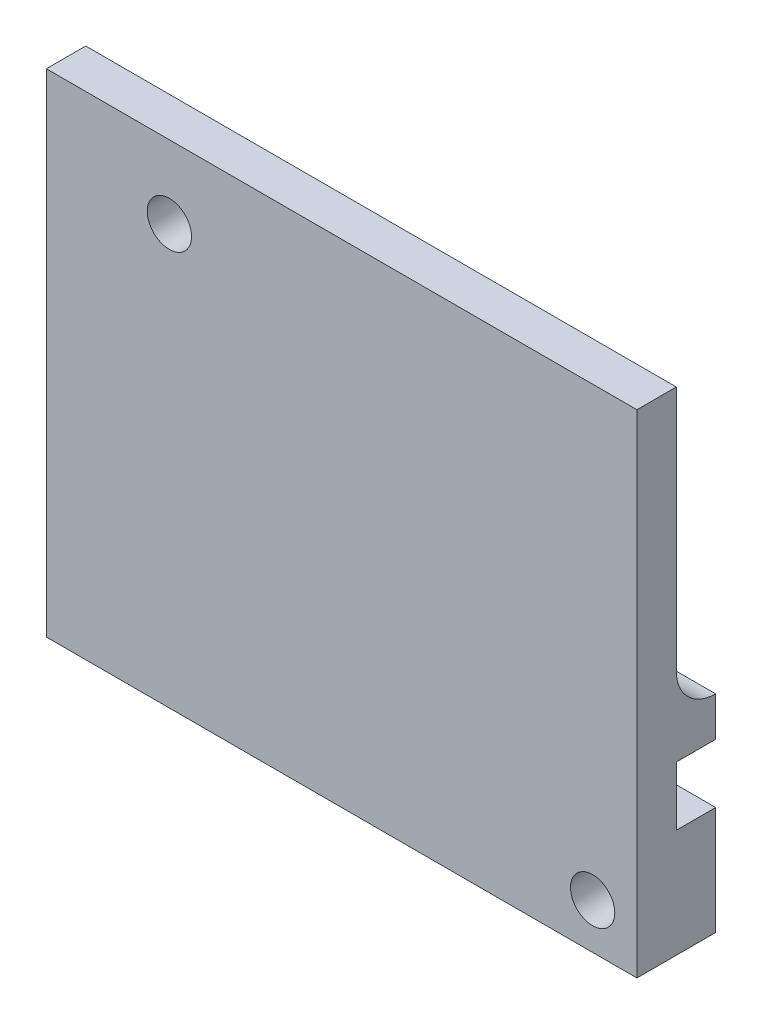
ISO-10303-21;
HEADER;
FILE_DESCRIPTION(('STEP AP214'),'2;1');
FILE_NAME('part.step','',(''),(''),'','','');
FILE_SCHEMA(('AUTOMOTIVE_DESIGN { 1 0 10303 214 1 1 1 1 }'));
ENDSEC;
DATA;
#1=APPLICATION_CONTEXT('core data for automotive mechanical design processes');
#2=APPLICATION_PROTOCOL_DEFINITION('international standard','automotive_design',2000,#1);
#3=PRODUCT_CONTEXT('',#1,'mechanical');
#4=PRODUCT('Part','Part','',(#3));
#5=PRODUCT_RELATED_PRODUCT_CATEGORY('part','',(#4));
#6=PRODUCT_DEFINITION_FORMATION('','',#4);
#7=PRODUCT_DEFINITION_CONTEXT('part definition',#1,'design');
#8=PRODUCT_DEFINITION('design','',#6,#7);
#9=PRODUCT_DEFINITION_SHAPE('','',#8);
#10=(LENGTH_UNIT() NAMED_UNIT(*) SI_UNIT(.MILLI.,.METRE.));
#11=(NAMED_UNIT(*) PLANE_ANGLE_UNIT() SI_UNIT($,.RADIAN.));
#12=(NAMED_UNIT(*) SI_UNIT($,.STERADIAN.) SOLID_ANGLE_UNIT());
#13=UNCERTAINTY_MEASURE_WITH_UNIT(LENGTH_MEASURE(1.E-05),#10,'distance_accuracy_value','');
#14=(GEOMETRIC_REPRESENTATION_CONTEXT(3) GLOBAL_UNCERTAINTY_ASSIGNED_CONTEXT((#13)) GLOBAL_UNIT_ASSIGNED_CONTEXT((#10,
#11,#12)) REPRESENTATION_CONTEXT('',''));
#15=CARTESIAN_POINT('',(0.,0.,0.));
#16=DIRECTION('',(0.,0.,1.));
#17=DIRECTION('',(1.,0.,0.));
#18=AXIS2_PLACEMENT_3D('',#15,#16,#17);
#19=CARTESIAN_POINT('',(0.,0.,0.));
#20=DIRECTION('',(0.,0.,-1.));
#21=DIRECTION('',(-1.,0.,0.));
#22=AXIS2_PLACEMENT_3D('',#19,#20,#21);
#23=PLANE('',#22);
#24=DIRECTION('',(0.,1.,0.));
#25=VECTOR('',#24,1.);
#26=CARTESIAN_POINT('',(60.,0.,0.));
#27=LINE('',#26,#25);
#28=CARTESIAN_POINT('',(60.,11.,0.));
#29=VERTEX_POINT('',#28);
#30=CARTESIAN_POINT('',(60.,17.,0.));
#31=VERTEX_POINT('',#30);
#32=EDGE_CURVE('E246',#29,#31,#27,.T.);
#33=ORIENTED_EDGE('',*,*,#32,.F.);
#34=DIRECTION('',(1.,0.,0.));
#35=VECTOR('',#34,1.);
#36=CARTESIAN_POINT('',(60.,11.,0.));
#37=LINE('',#36,#35);
#38=CARTESIAN_POINT('',(39.,11.,0.));
#39=VERTEX_POINT('',#38);
#40=EDGE_CURVE('E322',#39,#29,#37,.T.);
#41=ORIENTED_EDGE('',*,*,#40,.F.);
#42=CARTESIAN_POINT('',(39.,5.00000000000001,0.));
#43=DIRECTION('',(0.,0.,-1.));
#44=DIRECTION('',(-1.,0.,0.));
#45=AXIS2_PLACEMENT_3D('',#42,#43,#44);
#46=CIRCLE('',#45,6.00000000000001);
#47=CARTESIAN_POINT('',(33.,5.00000000000002,0.));
#48=VERTEX_POINT('',#47);
#49=EDGE_CURVE('E176',#48,#39,#46,.T.);
#50=ORIENTED_EDGE('',*,*,#49,.F.);
#51=DIRECTION('',(0.,1.,0.));
#52=VECTOR('',#51,1.);
#53=CARTESIAN_POINT('',(33.,5.00000000000002,0.));
#54=LINE('',#53,#52);
#55=CARTESIAN_POINT('',(33.,0.,0.));
#56=VERTEX_POINT('',#55);
#57=EDGE_CURVE('E172',#56,#48,#54,.T.);
#58=ORIENTED_EDGE('',*,*,#57,.F.);
#59=DIRECTION('',(1.,0.,0.));
#60=VECTOR('',#59,1.);
#61=CARTESIAN_POINT('',(0.,0.,0.));
#62=LINE('',#61,#60);
#63=CARTESIAN_POINT('',(27.,0.,0.));
#64=VERTEX_POINT('',#63);
#65=EDGE_CURVE('E243',#64,#56,#62,.T.);
#66=ORIENTED_EDGE('',*,*,#65,.F.);
#67=DIRECTION('',(0.,-1.,0.));
#68=VECTOR('',#67,1.);
#69=CARTESIAN_POINT('',(27.,5.00000000000002,0.));
#70=LINE('',#69,#68);
#71=CARTESIAN_POINT('',(27.,5.00000000000002,0.));
#72=VERTEX_POINT('',#71);
#73=EDGE_CURVE('E190',#72,#64,#70,.T.);
#74=ORIENTED_EDGE('',*,*,#73,.F.);
#75=CARTESIAN_POINT('',(21.,5.00000000000002,0.));
#76=DIRECTION('',(0.,0.,-1.));
#77=DIRECTION('',(-1.,0.,0.));
#78=AXIS2_PLACEMENT_3D('',#75,#76,#77);
#79=CIRCLE('',#78,6.);
#80=CARTESIAN_POINT('',(21.,11.,0.));
#81=VERTEX_POINT('',#80);
#82=EDGE_CURVE('E180',#81,#72,#79,.T.);
#83=ORIENTED_EDGE('',*,*,#82,.F.);
#84=DIRECTION('',(1.,0.,0.));
#85=VECTOR('',#84,1.);
#86=CARTESIAN_POINT('',(0.,11.,0.));
#87=LINE('',#86,#85);
#88=CARTESIAN_POINT('',(0.,11.,0.));
#89=VERTEX_POINT('',#88);
#90=EDGE_CURVE('E178',#89,#81,#87,.T.);
#91=ORIENTED_EDGE('',*,*,#90,.F.);
#92=DIRECTION('',(0.,-1.,0.));
#93=VECTOR('',#92,1.);
#94=CARTESIAN_POINT('',(0.,0.,0.));
#95=LINE('',#94,#93);
#96=CARTESIAN_POINT('',(0.,17.,0.));
#97=VERTEX_POINT('',#96);
#98=EDGE_CURVE('E228',#97,#89,#95,.T.);
#99=ORIENTED_EDGE('',*,*,#98,.F.);
#100=DIRECTION('',(-1.,0.,0.));
#101=VECTOR('',#100,1.);
#102=CARTESIAN_POINT('',(0.,17.,0.));
#103=LINE('',#102,#101);
#104=EDGE_CURVE('E209',#31,#97,#103,.T.);
#105=ORIENTED_EDGE('',*,*,#104,.F.);
#106=EDGE_LOOP('',(#33,#41,#50,#58,#66,#74,#83,#91,#99,#105));
#107=FACE_BOUND('',#106,.T.);
#108=ADVANCED_FACE('F40',(#107),#23,.T.);
#109=CARTESIAN_POINT('',(0.,0.,4.));
#110=DIRECTION('',(1.,0.,0.));
#111=DIRECTION('',(0.,0.,-1.));
#112=AXIS2_PLACEMENT_3D('',#109,#110,#111);
#113=PLANE('',#112);
#114=CARTESIAN_POINT('',(0.,50.,0.));
#115=VERTEX_POINT('',#114);
#116=CARTESIAN_POINT('',(0.,25.,0.));
#117=VERTEX_POINT('',#116);
#118=EDGE_CURVE('E240',#115,#117,#95,.T.);
#119=ORIENTED_EDGE('',*,*,#118,.T.);
#120=CARTESIAN_POINT('',(0.,25.,-4.));
#121=DIRECTION('',(1.,0.,0.));
#122=DIRECTION('',(0.,0.,-1.));
#123=AXIS2_PLACEMENT_3D('',#120,#121,#122);
#124=CIRCLE('',#123,4.);
#125=CARTESIAN_POINT('',(0.,21.,-4.));
#126=VERTEX_POINT('',#125);
#127=EDGE_CURVE('E11',#117,#126,#124,.T.);
#128=ORIENTED_EDGE('',*,*,#127,.T.);
#129=DIRECTION('',(0.,1.,0.));
#130=VECTOR('',#129,1.);
#131=CARTESIAN_POINT('',(0.,21.,-4.));
#132=LINE('',#131,#130);
#133=CARTESIAN_POINT('',(0.,17.,-4.));
#134=VERTEX_POINT('',#133);
#135=EDGE_CURVE('E210',#134,#126,#132,.T.);
#136=ORIENTED_EDGE('',*,*,#135,.F.);
#137=DIRECTION('',(0.,0.,1.));
#138=VECTOR('',#137,1.);
#139=CARTESIAN_POINT('',(0.,17.,-4.));
#140=LINE('',#139,#138);
#141=EDGE_CURVE('E220',#134,#97,#140,.T.);
#142=ORIENTED_EDGE('',*,*,#141,.T.);
#143=ORIENTED_EDGE('',*,*,#98,.T.);
#144=DIRECTION('',(0.,0.,1.));
#145=VECTOR('',#144,1.);
#146=CARTESIAN_POINT('',(0.,11.,-4.));
#147=LINE('',#146,#145);
#148=CARTESIAN_POINT('',(0.,11.,-4.));
#149=VERTEX_POINT('',#148);
#150=EDGE_CURVE('E207',#149,#89,#147,.T.);
#151=ORIENTED_EDGE('',*,*,#150,.F.);
#152=DIRECTION('',(0.,1.,0.));
#153=VECTOR('',#152,1.);
#154=CARTESIAN_POINT('',(0.,0.,-4.));
#155=LINE('',#154,#153);
#156=CARTESIAN_POINT('',(0.,0.,-4.));
#157=VERTEX_POINT('',#156);
#158=EDGE_CURVE('E189',#157,#149,#155,.T.);
#159=ORIENTED_EDGE('',*,*,#158,.F.);
#160=DIRECTION('',(0.,0.,-1.));
#161=VECTOR('',#160,1.);
#162=CARTESIAN_POINT('',(0.,0.,4.));
#163=LINE('',#162,#161);
#164=CARTESIAN_POINT('',(0.,0.,4.));
#165=VERTEX_POINT('',#164);
#166=EDGE_CURVE('E256',#165,#157,#163,.T.);
#167=ORIENTED_EDGE('',*,*,#166,.F.);
#168=DIRECTION('',(0.,-1.,0.));
#169=VECTOR('',#168,1.);
#170=CARTESIAN_POINT('',(0.,0.,4.));
#171=LINE('',#170,#169);
#172=CARTESIAN_POINT('',(0.,50.,4.));
#173=VERTEX_POINT('',#172);
#174=EDGE_CURVE('E229',#173,#165,#171,.T.);
#175=ORIENTED_EDGE('',*,*,#174,.F.);
#176=DIRECTION('',(0.,0.,-1.));
#177=VECTOR('',#176,1.);
#178=CARTESIAN_POINT('',(0.,50.,4.));
#179=LINE('',#178,#177);
#180=EDGE_CURVE('E239',#173,#115,#179,.T.);
#181=ORIENTED_EDGE('',*,*,#180,.T.);
#182=EDGE_LOOP('',(#119,#128,#136,#142,#143,#151,#159,#167,#175,#181));
#183=FACE_BOUND('',#182,.T.);
#184=ADVANCED_FACE('F275',(#183),#113,.F.);
#185=CARTESIAN_POINT('',(0.,0.,4.));
#186=DIRECTION('',(0.,1.,0.));
#187=DIRECTION('',(0.,0.,1.));
#188=AXIS2_PLACEMENT_3D('',#185,#186,#187);
#189=PLANE('',#188);
#190=ORIENTED_EDGE('',*,*,#166,.T.);
#191=DIRECTION('',(-1.,0.,0.));
#192=VECTOR('',#191,1.);
#193=CARTESIAN_POINT('',(27.,0.,-4.));
#194=LINE('',#193,#192);
#195=CARTESIAN_POINT('',(27.,0.,-4.));
#196=VERTEX_POINT('',#195);
#197=EDGE_CURVE('E186',#196,#157,#194,.T.);
#198=ORIENTED_EDGE('',*,*,#197,.F.);
#199=DIRECTION('',(0.,0.,1.));
#200=VECTOR('',#199,1.);
#201=CARTESIAN_POINT('',(27.,0.,-4.));
#202=LINE('',#201,#200);
#203=EDGE_CURVE('E64',#196,#64,#202,.T.);
#204=ORIENTED_EDGE('',*,*,#203,.T.);
#205=ORIENTED_EDGE('',*,*,#65,.T.);
#206=DIRECTION('',(0.,0.,1.));
#207=VECTOR('',#206,1.);
#208=CARTESIAN_POINT('',(33.,0.,-4.));
#209=LINE('',#208,#207);
#210=CARTESIAN_POINT('',(33.,0.,-4.));
#211=VERTEX_POINT('',#210);
#212=EDGE_CURVE('E182',#211,#56,#209,.T.);
#213=ORIENTED_EDGE('',*,*,#212,.F.);
#214=DIRECTION('',(-1.,0.,0.));
#215=VECTOR('',#214,1.);
#216=CARTESIAN_POINT('',(33.,0.,-4.));
#217=LINE('',#216,#215);
#218=CARTESIAN_POINT('',(60.,0.,-4.));
#219=VERTEX_POINT('',#218);
#220=EDGE_CURVE('E314',#219,#211,#217,.T.);
#221=ORIENTED_EDGE('',*,*,#220,.F.);
#222=DIRECTION('',(0.,0.,-1.));
#223=VECTOR('',#222,1.);
#224=CARTESIAN_POINT('',(60.,0.,4.));
#225=LINE('',#224,#223);
#226=CARTESIAN_POINT('',(60.,0.,4.));
#227=VERTEX_POINT('',#226);
#228=EDGE_CURVE('E254',#227,#219,#225,.T.);
#229=ORIENTED_EDGE('',*,*,#228,.F.);
#230=DIRECTION('',(1.,0.,0.));
#231=VECTOR('',#230,1.);
#232=CARTESIAN_POINT('',(0.,0.,4.));
#233=LINE('',#232,#231);
#234=EDGE_CURVE('E232',#165,#227,#233,.T.);
#235=ORIENTED_EDGE('',*,*,#234,.F.);
#236=EDGE_LOOP('',(#190,#198,#204,#205,#213,#221,#229,#235));
#237=FACE_BOUND('',#236,.T.);
#238=ADVANCED_FACE('F304',(#237),#189,.F.);
#239=CARTESIAN_POINT('',(60.,0.,4.));
#240=DIRECTION('',(-1.,0.,0.));
#241=DIRECTION('',(0.,0.,1.));
#242=AXIS2_PLACEMENT_3D('',#239,#240,#241);
#243=PLANE('',#242);
#244=ORIENTED_EDGE('',*,*,#228,.T.);
#245=DIRECTION('',(0.,-1.,0.));
#246=VECTOR('',#245,1.);
#247=CARTESIAN_POINT('',(60.,0.,-4.));
#248=LINE('',#247,#246);
#249=CARTESIAN_POINT('',(60.,11.,-4.));
#250=VERTEX_POINT('',#249);
#251=EDGE_CURVE('E162',#250,#219,#248,.T.);
#252=ORIENTED_EDGE('',*,*,#251,.F.);
#253=DIRECTION('',(0.,0.,1.));
#254=VECTOR('',#253,1.);
#255=CARTESIAN_POINT('',(60.,11.,-4.));
#256=LINE('',#255,#254);
#257=EDGE_CURVE('E56',#250,#29,#256,.T.);
#258=ORIENTED_EDGE('',*,*,#257,.T.);
#259=ORIENTED_EDGE('',*,*,#32,.T.);
#260=DIRECTION('',(0.,0.,1.));
#261=VECTOR('',#260,1.);
#262=CARTESIAN_POINT('',(60.,17.,-4.));
#263=LINE('',#262,#261);
#264=CARTESIAN_POINT('',(60.,17.,-4.));
#265=VERTEX_POINT('',#264);
#266=EDGE_CURVE('E225',#265,#31,#263,.T.);
#267=ORIENTED_EDGE('',*,*,#266,.F.);
#268=DIRECTION('',(0.,-1.,0.));
#269=VECTOR('',#268,1.);
#270=CARTESIAN_POINT('',(60.,21.,-4.));
#271=LINE('',#270,#269);
#272=CARTESIAN_POINT('',(60.,21.,-4.));
#273=VERTEX_POINT('',#272);
#274=EDGE_CURVE('E216',#273,#265,#271,.T.);
#275=ORIENTED_EDGE('',*,*,#274,.F.);
#276=CARTESIAN_POINT('',(60.,25.,-4.));
#277=DIRECTION('',(-1.,0.,0.));
#278=DIRECTION('',(0.,0.,1.));
#279=AXIS2_PLACEMENT_3D('',#276,#277,#278);
#280=CIRCLE('',#279,4.);
#281=CARTESIAN_POINT('',(60.,25.,0.));
#282=VERTEX_POINT('',#281);
#283=EDGE_CURVE('E49',#273,#282,#280,.T.);
#284=ORIENTED_EDGE('',*,*,#283,.T.);
#285=CARTESIAN_POINT('',(60.,50.,0.));
#286=VERTEX_POINT('',#285);
#287=EDGE_CURVE('E245',#282,#286,#27,.T.);
#288=ORIENTED_EDGE('',*,*,#287,.T.);
#289=DIRECTION('',(0.,0.,-1.));
#290=VECTOR('',#289,1.);
#291=CARTESIAN_POINT('',(60.,50.,4.));
#292=LINE('',#291,#290);
#293=CARTESIAN_POINT('',(60.,50.,4.));
#294=VERTEX_POINT('',#293);
#295=EDGE_CURVE('E251',#294,#286,#292,.T.);
#296=ORIENTED_EDGE('',*,*,#295,.F.);
#297=DIRECTION('',(0.,1.,0.));
#298=VECTOR('',#297,1.);
#299=CARTESIAN_POINT('',(60.,0.,4.));
#300=LINE('',#299,#298);
#301=EDGE_CURVE('E235',#227,#294,#300,.T.);
#302=ORIENTED_EDGE('',*,*,#301,.F.);
#303=EDGE_LOOP('',(#244,#252,#258,#259,#267,#275,#284,#288,#296,#302));
#304=FACE_BOUND('',#303,.T.);
#305=ADVANCED_FACE('F262',(#304),#243,.F.);
#306=CARTESIAN_POINT('',(0.,50.,4.));
#307=DIRECTION('',(0.,-1.,0.));
#308=DIRECTION('',(0.,0.,-1.));
#309=AXIS2_PLACEMENT_3D('',#306,#307,#308);
#310=PLANE('',#309);
#311=DIRECTION('',(-1.,0.,0.));
#312=VECTOR('',#311,1.);
#313=CARTESIAN_POINT('',(0.,50.,0.));
#314=LINE('',#313,#312);
#315=EDGE_CURVE('E233',#286,#115,#314,.T.);
#316=ORIENTED_EDGE('',*,*,#315,.T.);
#317=ORIENTED_EDGE('',*,*,#180,.F.);
#318=DIRECTION('',(-1.,0.,0.));
#319=VECTOR('',#318,1.);
#320=CARTESIAN_POINT('',(0.,50.,4.));
#321=LINE('',#320,#319);
#322=EDGE_CURVE('E237',#294,#173,#321,.T.);
#323=ORIENTED_EDGE('',*,*,#322,.F.);
#324=ORIENTED_EDGE('',*,*,#295,.T.);
#325=EDGE_LOOP('',(#316,#317,#323,#324));
#326=FACE_BOUND('',#325,.T.);
#327=ADVANCED_FACE('F313',(#326),#310,.F.);
#328=CARTESIAN_POINT('',(0.,0.,4.));
#329=DIRECTION('',(0.,0.,-1.));
#330=DIRECTION('',(-1.,0.,0.));
#331=AXIS2_PLACEMENT_3D('',#328,#329,#330);
#332=PLANE('',#331);
#333=CARTESIAN_POINT('',(12.5,42.6000000000001,4.));
#334=DIRECTION('',(0.,0.,1.));
#335=DIRECTION('',(1.,0.,0.));
#336=AXIS2_PLACEMENT_3D('',#333,#334,#335);
#337=CIRCLE('',#336,2.24999999999999);
#338=CARTESIAN_POINT('',(14.75,42.6000000000001,4.));
#339=VERTEX_POINT('',#338);
#340=EDGE_CURVE('E357',#339,#339,#337,.T.);
#341=ORIENTED_EDGE('',*,*,#340,.F.);
#342=EDGE_LOOP('',(#341));
#343=FACE_BOUND('',#342,.T.);
#344=CARTESIAN_POINT('',(55.4999999999999,4.60000000000001,4.));
#345=DIRECTION('',(0.,0.,1.));
#346=DIRECTION('',(1.,0.,0.));
#347=AXIS2_PLACEMENT_3D('',#344,#345,#346);
#348=CIRCLE('',#347,2.25);
#349=CARTESIAN_POINT('',(57.7499999999999,4.60000000000001,4.));
#350=VERTEX_POINT('',#349);
#351=EDGE_CURVE('E364',#350,#350,#348,.T.);
#352=ORIENTED_EDGE('',*,*,#351,.F.);
#353=EDGE_LOOP('',(#352));
#354=FACE_BOUND('',#353,.T.);
#355=ORIENTED_EDGE('',*,*,#174,.T.);
#356=ORIENTED_EDGE('',*,*,#234,.T.);
#357=ORIENTED_EDGE('',*,*,#301,.T.);
#358=ORIENTED_EDGE('',*,*,#322,.T.);
#359=EDGE_LOOP('',(#355,#356,#357,#358));
#360=FACE_BOUND('',#359,.T.);
#361=ADVANCED_FACE('F309',(#343,#354,#360),#332,.F.);
#362=CARTESIAN_POINT('',(12.5,42.6000000000001,0.));
#363=DIRECTION('',(0.,0.,-1.));
#364=DIRECTION('',(-1.,0.,0.));
#365=AXIS2_PLACEMENT_3D('',#362,#363,#364);
#366=CIRCLE('',#365,2.24999999999999);
#367=CARTESIAN_POINT('',(10.25,42.6000000000001,0.));
#368=VERTEX_POINT('',#367);
#369=EDGE_CURVE('E44',#368,#368,#366,.T.);
#370=ORIENTED_EDGE('',*,*,#369,.F.);
#371=EDGE_LOOP('',(#370));
#372=FACE_BOUND('',#371,.T.);
#373=ORIENTED_EDGE('',*,*,#287,.F.);
#374=DIRECTION('',(1.,0.,0.));
#375=VECTOR('',#374,1.);
#376=CARTESIAN_POINT('',(0.,25.,0.));
#377=LINE('',#376,#375);
#378=EDGE_CURVE('E258',#282,#117,#377,.F.);
#379=ORIENTED_EDGE('',*,*,#378,.T.);
#380=ORIENTED_EDGE('',*,*,#118,.F.);
#381=ORIENTED_EDGE('',*,*,#315,.F.);
#382=EDGE_LOOP('',(#373,#379,#380,#381));
#383=FACE_BOUND('',#382,.T.);
#384=ADVANCED_FACE('F270',(#372,#383),#23,.T.);
#385=CARTESIAN_POINT('',(0.,17.,-4.));
#386=DIRECTION('',(0.,1.,0.));
#387=DIRECTION('',(-1.,0.,0.));
#388=AXIS2_PLACEMENT_3D('',#385,#386,#387);
#389=PLANE('',#388);
#390=ORIENTED_EDGE('',*,*,#104,.T.);
#391=ORIENTED_EDGE('',*,*,#141,.F.);
#392=DIRECTION('',(-1.,0.,0.));
#393=VECTOR('',#392,1.);
#394=CARTESIAN_POINT('',(0.,17.,-4.));
#395=LINE('',#394,#393);
#396=EDGE_CURVE('E218',#265,#134,#395,.T.);
#397=ORIENTED_EDGE('',*,*,#396,.F.);
#398=ORIENTED_EDGE('',*,*,#266,.T.);
#399=EDGE_LOOP('',(#390,#391,#397,#398));
#400=FACE_BOUND('',#399,.T.);
#401=ADVANCED_FACE('F281',(#400),#389,.F.);
#402=CARTESIAN_POINT('',(0.,0.,-4.));
#403=DIRECTION('',(0.,0.,1.));
#404=DIRECTION('',(1.,0.,0.));
#405=AXIS2_PLACEMENT_3D('',#402,#403,#404);
#406=PLANE('',#405);
#407=ORIENTED_EDGE('',*,*,#135,.T.);
#408=DIRECTION('',(1.,0.,0.));
#409=VECTOR('',#408,1.);
#410=CARTESIAN_POINT('',(0.,21.,-4.));
#411=LINE('',#410,#409);
#412=EDGE_CURVE('E213',#126,#273,#411,.T.);
#413=ORIENTED_EDGE('',*,*,#412,.T.);
#414=ORIENTED_EDGE('',*,*,#274,.T.);
#415=ORIENTED_EDGE('',*,*,#396,.T.);
#416=EDGE_LOOP('',(#407,#413,#414,#415));
#417=FACE_BOUND('',#416,.T.);
#418=ADVANCED_FACE('F277',(#417),#406,.F.);
#419=CARTESIAN_POINT('',(0.,25.,-4.));
#420=DIRECTION('',(1.,0.,0.));
#421=DIRECTION('',(0.,1.,0.));
#422=AXIS2_PLACEMENT_3D('',#419,#420,#421);
#423=CYLINDRICAL_SURFACE('',#422,4.);
#424=ORIENTED_EDGE('',*,*,#127,.F.);
#425=ORIENTED_EDGE('',*,*,#378,.F.);
#426=ORIENTED_EDGE('',*,*,#283,.F.);
#427=ORIENTED_EDGE('',*,*,#412,.F.);
#428=EDGE_LOOP('',(#424,#425,#426,#427));
#429=FACE_BOUND('',#428,.T.);
#430=ADVANCED_FACE('F42',(#429),#423,.F.);
#431=CARTESIAN_POINT('',(0.,11.,-4.));
#432=DIRECTION('',(0.,-1.,0.));
#433=DIRECTION('',(0.,0.,-1.));
#434=AXIS2_PLACEMENT_3D('',#431,#432,#433);
#435=PLANE('',#434);
#436=ORIENTED_EDGE('',*,*,#90,.T.);
#437=DIRECTION('',(0.,0.,1.));
#438=VECTOR('',#437,1.);
#439=CARTESIAN_POINT('',(21.,11.,-4.));
#440=LINE('',#439,#438);
#441=CARTESIAN_POINT('',(21.,11.,-4.));
#442=VERTEX_POINT('',#441);
#443=EDGE_CURVE('E204',#442,#81,#440,.T.);
#444=ORIENTED_EDGE('',*,*,#443,.F.);
#445=DIRECTION('',(1.,0.,0.));
#446=VECTOR('',#445,1.);
#447=CARTESIAN_POINT('',(0.,11.,-4.));
#448=LINE('',#447,#446);
#449=EDGE_CURVE('E192',#149,#442,#448,.T.);
#450=ORIENTED_EDGE('',*,*,#449,.F.);
#451=ORIENTED_EDGE('',*,*,#150,.T.);
#452=EDGE_LOOP('',(#436,#444,#450,#451));
#453=FACE_BOUND('',#452,.T.);
#454=ADVANCED_FACE('F294',(#453),#435,.F.);
#455=CARTESIAN_POINT('',(21.,5.00000000000002,-4.));
#456=DIRECTION('',(0.,0.,1.));
#457=DIRECTION('',(1.,0.,0.));
#458=AXIS2_PLACEMENT_3D('',#455,#456,#457);
#459=CYLINDRICAL_SURFACE('',#458,6.);
#460=ORIENTED_EDGE('',*,*,#82,.T.);
#461=DIRECTION('',(0.,0.,1.));
#462=VECTOR('',#461,1.);
#463=CARTESIAN_POINT('',(27.,5.00000000000002,-4.));
#464=LINE('',#463,#462);
#465=CARTESIAN_POINT('',(27.,5.00000000000002,-4.));
#466=VERTEX_POINT('',#465);
#467=EDGE_CURVE('E201',#466,#72,#464,.T.);
#468=ORIENTED_EDGE('',*,*,#467,.F.);
#469=CARTESIAN_POINT('',(21.,5.00000000000002,-4.));
#470=DIRECTION('',(0.,0.,-1.));
#471=DIRECTION('',(-1.,0.,0.));
#472=AXIS2_PLACEMENT_3D('',#469,#470,#471);
#473=CIRCLE('',#472,6.);
#474=EDGE_CURVE('E194',#442,#466,#473,.T.);
#475=ORIENTED_EDGE('',*,*,#474,.F.);
#476=ORIENTED_EDGE('',*,*,#443,.T.);
#477=EDGE_LOOP('',(#460,#468,#475,#476));
#478=FACE_BOUND('',#477,.T.);
#479=ADVANCED_FACE('F297',(#478),#459,.T.);
#480=CARTESIAN_POINT('',(27.,5.00000000000002,-4.));
#481=DIRECTION('',(-1.,0.,0.));
#482=DIRECTION('',(0.,0.,1.));
#483=AXIS2_PLACEMENT_3D('',#480,#481,#482);
#484=PLANE('',#483);
#485=ORIENTED_EDGE('',*,*,#73,.T.);
#486=ORIENTED_EDGE('',*,*,#203,.F.);
#487=DIRECTION('',(0.,-1.,0.));
#488=VECTOR('',#487,1.);
#489=CARTESIAN_POINT('',(27.,5.00000000000002,-4.));
#490=LINE('',#489,#488);
#491=EDGE_CURVE('E196',#466,#196,#490,.T.);
#492=ORIENTED_EDGE('',*,*,#491,.F.);
#493=ORIENTED_EDGE('',*,*,#467,.T.);
#494=EDGE_LOOP('',(#485,#486,#492,#493));
#495=FACE_BOUND('',#494,.T.);
#496=ADVANCED_FACE('F330',(#495),#484,.F.);
#497=CARTESIAN_POINT('',(21.,5.00000000000002,-4.));
#498=DIRECTION('',(0.,0.,-1.));
#499=DIRECTION('',(-1.,0.,0.));
#500=AXIS2_PLACEMENT_3D('',#497,#498,#499);
#501=PLANE('',#500);
#502=ORIENTED_EDGE('',*,*,#197,.T.);
#503=ORIENTED_EDGE('',*,*,#158,.T.);
#504=ORIENTED_EDGE('',*,*,#449,.T.);
#505=ORIENTED_EDGE('',*,*,#474,.T.);
#506=ORIENTED_EDGE('',*,*,#491,.T.);
#507=EDGE_LOOP('',(#502,#503,#504,#505,#506));
#508=FACE_BOUND('',#507,.T.);
#509=ADVANCED_FACE('F301',(#508),#501,.T.);
#510=CARTESIAN_POINT('',(39.,5.00000000000001,-4.));
#511=DIRECTION('',(0.,0.,1.));
#512=DIRECTION('',(1.,0.,0.));
#513=AXIS2_PLACEMENT_3D('',#510,#511,#512);
#514=CYLINDRICAL_SURFACE('',#513,6.00000000000001);
#515=ORIENTED_EDGE('',*,*,#49,.T.);
#516=DIRECTION('',(0.,0.,1.));
#517=VECTOR('',#516,1.);
#518=CARTESIAN_POINT('',(39.,11.,-4.));
#519=LINE('',#518,#517);
#520=CARTESIAN_POINT('',(39.,11.,-4.));
#521=VERTEX_POINT('',#520);
#522=EDGE_CURVE('E158',#521,#39,#519,.T.);
#523=ORIENTED_EDGE('',*,*,#522,.F.);
#524=CARTESIAN_POINT('',(39.,5.00000000000001,-4.));
#525=DIRECTION('',(0.,0.,-1.));
#526=DIRECTION('',(-1.,0.,0.));
#527=AXIS2_PLACEMENT_3D('',#524,#525,#526);
#528=CIRCLE('',#527,6.00000000000001);
#529=CARTESIAN_POINT('',(33.,5.00000000000002,-4.));
#530=VERTEX_POINT('',#529);
#531=EDGE_CURVE('E163',#530,#521,#528,.T.);
#532=ORIENTED_EDGE('',*,*,#531,.F.);
#533=DIRECTION('',(0.,0.,1.));
#534=VECTOR('',#533,1.);
#535=CARTESIAN_POINT('',(33.,5.00000000000002,-4.));
#536=LINE('',#535,#534);
#537=EDGE_CURVE('E318',#530,#48,#536,.T.);
#538=ORIENTED_EDGE('',*,*,#537,.T.);
#539=EDGE_LOOP('',(#515,#523,#532,#538));
#540=FACE_BOUND('',#539,.T.);
#541=ADVANCED_FACE('F174',(#540),#514,.T.);
#542=CARTESIAN_POINT('',(60.,11.,-4.));
#543=DIRECTION('',(0.,-1.,0.));
#544=DIRECTION('',(0.,0.,-1.));
#545=AXIS2_PLACEMENT_3D('',#542,#543,#544);
#546=PLANE('',#545);
#547=ORIENTED_EDGE('',*,*,#40,.T.);
#548=ORIENTED_EDGE('',*,*,#257,.F.);
#549=DIRECTION('',(1.,0.,0.));
#550=VECTOR('',#549,1.);
#551=CARTESIAN_POINT('',(60.,11.,-4.));
#552=LINE('',#551,#550);
#553=EDGE_CURVE('E154',#521,#250,#552,.T.);
#554=ORIENTED_EDGE('',*,*,#553,.F.);
#555=ORIENTED_EDGE('',*,*,#522,.T.);
#556=EDGE_LOOP('',(#547,#548,#554,#555));
#557=FACE_BOUND('',#556,.T.);
#558=ADVANCED_FACE('F156',(#557),#546,.F.);
#559=CARTESIAN_POINT('',(33.,5.00000000000002,-4.));
#560=DIRECTION('',(1.,0.,0.));
#561=DIRECTION('',(0.,0.,-1.));
#562=AXIS2_PLACEMENT_3D('',#559,#560,#561);
#563=PLANE('',#562);
#564=ORIENTED_EDGE('',*,*,#57,.T.);
#565=ORIENTED_EDGE('',*,*,#537,.F.);
#566=DIRECTION('',(0.,1.,0.));
#567=VECTOR('',#566,1.);
#568=CARTESIAN_POINT('',(33.,5.00000000000002,-4.));
#569=LINE('',#568,#567);
#570=EDGE_CURVE('E168',#211,#530,#569,.T.);
#571=ORIENTED_EDGE('',*,*,#570,.F.);
#572=ORIENTED_EDGE('',*,*,#212,.T.);
#573=EDGE_LOOP('',(#564,#565,#571,#572));
#574=FACE_BOUND('',#573,.T.);
#575=ADVANCED_FACE('F327',(#574),#563,.F.);
#576=CARTESIAN_POINT('',(39.,5.00000000000001,-4.));
#577=DIRECTION('',(0.,0.,-1.));
#578=DIRECTION('',(-1.,0.,0.));
#579=AXIS2_PLACEMENT_3D('',#576,#577,#578);
#580=PLANE('',#579);
#581=CARTESIAN_POINT('',(55.4999999999999,4.60000000000001,-4.));
#582=DIRECTION('',(0.,0.,1.));
#583=DIRECTION('',(1.,0.,0.));
#584=AXIS2_PLACEMENT_3D('',#581,#582,#583);
#585=CIRCLE('',#584,2.25);
#586=CARTESIAN_POINT('',(57.7499999999999,4.60000000000001,-4.));
#587=VERTEX_POINT('',#586);
#588=EDGE_CURVE('E359',#587,#587,#585,.T.);
#589=ORIENTED_EDGE('',*,*,#588,.T.);
#590=EDGE_LOOP('',(#589));
#591=FACE_BOUND('',#590,.T.);
#592=ORIENTED_EDGE('',*,*,#531,.T.);
#593=ORIENTED_EDGE('',*,*,#553,.T.);
#594=ORIENTED_EDGE('',*,*,#251,.T.);
#595=ORIENTED_EDGE('',*,*,#220,.T.);
#596=ORIENTED_EDGE('',*,*,#570,.T.);
#597=EDGE_LOOP('',(#592,#593,#594,#595,#596));
#598=FACE_BOUND('',#597,.T.);
#599=ADVANCED_FACE('F166',(#591,#598),#580,.T.);
#600=CARTESIAN_POINT('',(55.4999999999999,4.60000000000001,-4.));
#601=DIRECTION('',(0.,0.,1.));
#602=DIRECTION('',(1.,0.,0.));
#603=AXIS2_PLACEMENT_3D('',#600,#601,#602);
#604=CYLINDRICAL_SURFACE('',#603,2.25);
#605=ORIENTED_EDGE('',*,*,#588,.F.);
#606=EDGE_LOOP('',(#605));
#607=FACE_BOUND('',#606,.T.);
#608=ORIENTED_EDGE('',*,*,#351,.T.);
#609=EDGE_LOOP('',(#608));
#610=FACE_BOUND('',#609,.T.);
#611=ADVANCED_FACE('F370',(#607,#610),#604,.F.);
#612=CARTESIAN_POINT('',(12.5,42.6000000000001,-4.));
#613=DIRECTION('',(0.,0.,1.));
#614=DIRECTION('',(1.,0.,0.));
#615=AXIS2_PLACEMENT_3D('',#612,#613,#614);
#616=CYLINDRICAL_SURFACE('',#615,2.24999999999999);
#617=ORIENTED_EDGE('',*,*,#369,.T.);
#618=EDGE_LOOP('',(#617));
#619=FACE_BOUND('',#618,.T.);
#620=ORIENTED_EDGE('',*,*,#340,.T.);
#621=EDGE_LOOP('',(#620));
#622=FACE_BOUND('',#621,.T.);
#623=ADVANCED_FACE('F373',(#619,#622),#616,.F.);
#624=CLOSED_SHELL('',(#108,#184,#238,#305,#327,#361,#384,#401,#418,#430,#454,#479,#496,#509,
#541,#558,#575,#599,#611,#623));
#625=MANIFOLD_SOLID_BREP('B2',#624);
#626=ADVANCED_BREP_SHAPE_REPRESENTATION('',(#18,#625),#14);
#627=SHAPE_DEFINITION_REPRESENTATION(#9,#626);
ENDSEC;
END-ISO-10303-21;
